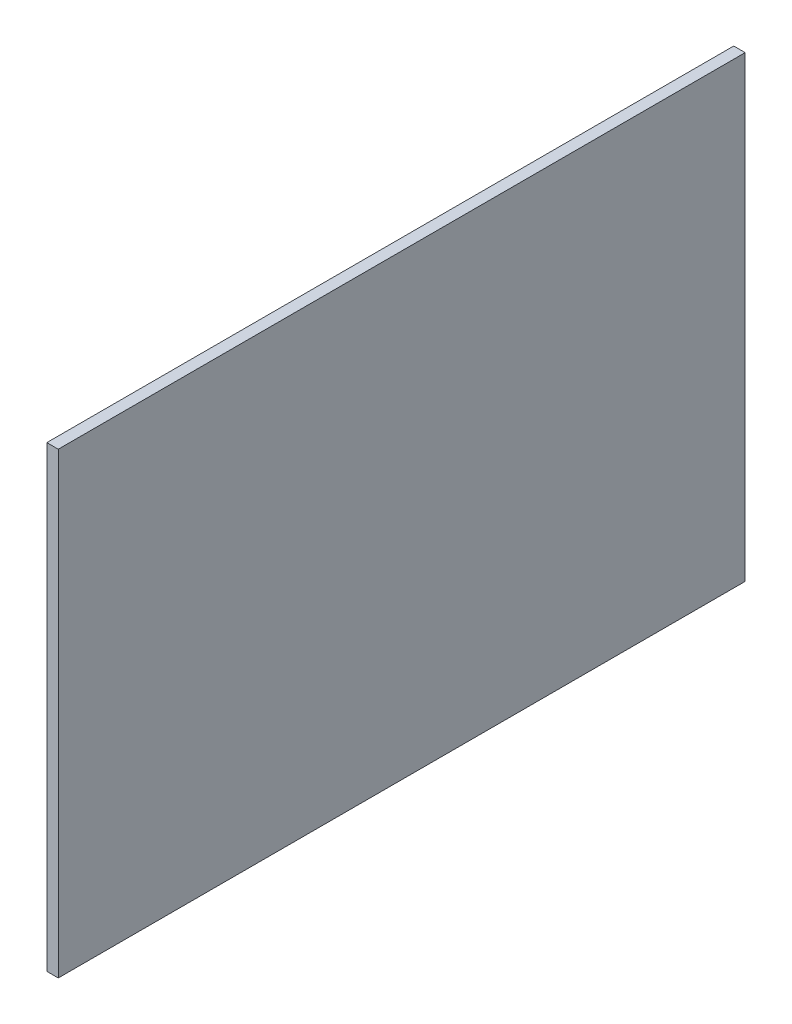
ISO-10303-21;
HEADER;
FILE_DESCRIPTION(('STEP AP214'),'2;1');
FILE_NAME('part.step','',(''),(''),'','','');
FILE_SCHEMA(('AUTOMOTIVE_DESIGN { 1 0 10303 214 1 1 1 1 }'));
ENDSEC;
DATA;
#1=APPLICATION_CONTEXT('core data for automotive mechanical design processes');
#2=APPLICATION_PROTOCOL_DEFINITION('international standard','automotive_design',2000,#1);
#3=PRODUCT_CONTEXT('',#1,'mechanical');
#4=PRODUCT('Part','Part','',(#3));
#5=PRODUCT_RELATED_PRODUCT_CATEGORY('part','',(#4));
#6=PRODUCT_DEFINITION_FORMATION('','',#4);
#7=PRODUCT_DEFINITION_CONTEXT('part definition',#1,'design');
#8=PRODUCT_DEFINITION('design','',#6,#7);
#9=PRODUCT_DEFINITION_SHAPE('','',#8);
#10=(LENGTH_UNIT() NAMED_UNIT(*) SI_UNIT(.MILLI.,.METRE.));
#11=(NAMED_UNIT(*) PLANE_ANGLE_UNIT() SI_UNIT($,.RADIAN.));
#12=(NAMED_UNIT(*) SI_UNIT($,.STERADIAN.) SOLID_ANGLE_UNIT());
#13=UNCERTAINTY_MEASURE_WITH_UNIT(LENGTH_MEASURE(1.E-05),#10,'distance_accuracy_value','');
#14=(GEOMETRIC_REPRESENTATION_CONTEXT(3) GLOBAL_UNCERTAINTY_ASSIGNED_CONTEXT((#13)) GLOBAL_UNIT_ASSIGNED_CONTEXT((#10,
#11,#12)) REPRESENTATION_CONTEXT('',''));
#15=CARTESIAN_POINT('',(0.,0.,0.));
#16=DIRECTION('',(0.,0.,1.));
#17=DIRECTION('',(1.,0.,0.));
#18=AXIS2_PLACEMENT_3D('',#15,#16,#17);
#19=CARTESIAN_POINT('',(0.,0.,0.));
#20=DIRECTION('',(1.,0.,0.));
#21=DIRECTION('',(0.,0.,-1.));
#22=AXIS2_PLACEMENT_3D('',#19,#20,#21);
#23=PLANE('',#22);
#24=DIRECTION('',(0.,-1.,0.));
#25=VECTOR('',#24,1.);
#26=CARTESIAN_POINT('',(0.,-100.,150.));
#27=LINE('',#26,#25);
#28=CARTESIAN_POINT('',(0.,100.,150.));
#29=VERTEX_POINT('',#28);
#30=CARTESIAN_POINT('',(0.,-100.,150.));
#31=VERTEX_POINT('',#30);
#32=EDGE_CURVE('E142',#29,#31,#27,.T.);
#33=ORIENTED_EDGE('',*,*,#32,.F.);
#34=DIRECTION('',(0.,0.,1.));
#35=VECTOR('',#34,1.);
#36=CARTESIAN_POINT('',(0.,100.,-150.));
#37=LINE('',#36,#35);
#38=CARTESIAN_POINT('',(0.,100.,-150.));
#39=VERTEX_POINT('',#38);
#40=EDGE_CURVE('E155',#39,#29,#37,.T.);
#41=ORIENTED_EDGE('',*,*,#40,.F.);
#42=DIRECTION('',(0.,1.,0.));
#43=VECTOR('',#42,1.);
#44=CARTESIAN_POINT('',(0.,-100.,-150.));
#45=LINE('',#44,#43);
#46=CARTESIAN_POINT('',(0.,-100.,-150.));
#47=VERTEX_POINT('',#46);
#48=EDGE_CURVE('E163',#47,#39,#45,.T.);
#49=ORIENTED_EDGE('',*,*,#48,.F.);
#50=DIRECTION('',(0.,0.,-1.));
#51=VECTOR('',#50,1.);
#52=CARTESIAN_POINT('',(0.,-100.,-150.));
#53=LINE('',#52,#51);
#54=EDGE_CURVE('E145',#31,#47,#53,.T.);
#55=ORIENTED_EDGE('',*,*,#54,.F.);
#56=EDGE_LOOP('',(#33,#41,#49,#55));
#57=FACE_BOUND('',#56,.T.);
#58=CARTESIAN_POINT('',(0.,85.,135.));
#59=DIRECTION('',(-1.,0.,0.));
#60=DIRECTION('',(0.,0.,-1.));
#61=AXIS2_PLACEMENT_3D('',#58,#59,#60);
#62=CIRCLE('',#61,10.);
#63=CARTESIAN_POINT('',(0.,84.9999999999999,145.));
#64=VERTEX_POINT('',#63);
#65=CARTESIAN_POINT('',(0.,95.,135.));
#66=VERTEX_POINT('',#65);
#67=EDGE_CURVE('E48',#64,#66,#62,.T.);
#68=ORIENTED_EDGE('',*,*,#67,.F.);
#69=DIRECTION('',(0.,1.,0.));
#70=VECTOR('',#69,1.);
#71=CARTESIAN_POINT('',(0.,-84.9999999999999,145.));
#72=LINE('',#71,#70);
#73=CARTESIAN_POINT('',(0.,-84.9999999999999,145.));
#74=VERTEX_POINT('',#73);
#75=EDGE_CURVE('E52',#74,#64,#72,.T.);
#76=ORIENTED_EDGE('',*,*,#75,.F.);
#77=CARTESIAN_POINT('',(0.,-85.,135.));
#78=DIRECTION('',(-1.,0.,0.));
#79=DIRECTION('',(0.,0.,-1.));
#80=AXIS2_PLACEMENT_3D('',#77,#78,#79);
#81=CIRCLE('',#80,10.);
#82=CARTESIAN_POINT('',(0.,-95.,135.));
#83=VERTEX_POINT('',#82);
#84=EDGE_CURVE('E325',#83,#74,#81,.T.);
#85=ORIENTED_EDGE('',*,*,#84,.F.);
#86=DIRECTION('',(0.,0.,1.));
#87=VECTOR('',#86,1.);
#88=CARTESIAN_POINT('',(0.,-95.,-135.));
#89=LINE('',#88,#87);
#90=CARTESIAN_POINT('',(0.,-95.,-135.));
#91=VERTEX_POINT('',#90);
#92=EDGE_CURVE('E359',#91,#83,#89,.T.);
#93=ORIENTED_EDGE('',*,*,#92,.F.);
#94=CARTESIAN_POINT('',(0.,-85.,-135.));
#95=DIRECTION('',(-1.,0.,0.));
#96=DIRECTION('',(0.,0.,1.));
#97=AXIS2_PLACEMENT_3D('',#94,#95,#96);
#98=CIRCLE('',#97,10.);
#99=CARTESIAN_POINT('',(0.,-84.9999999999999,-145.));
#100=VERTEX_POINT('',#99);
#101=EDGE_CURVE('E352',#100,#91,#98,.T.);
#102=ORIENTED_EDGE('',*,*,#101,.F.);
#103=DIRECTION('',(0.,-1.,0.));
#104=VECTOR('',#103,1.);
#105=CARTESIAN_POINT('',(0.,84.9999999999999,-145.));
#106=LINE('',#105,#104);
#107=CARTESIAN_POINT('',(0.,84.9999999999999,-145.));
#108=VERTEX_POINT('',#107);
#109=EDGE_CURVE('E346',#108,#100,#106,.T.);
#110=ORIENTED_EDGE('',*,*,#109,.F.);
#111=CARTESIAN_POINT('',(0.,85.,-135.));
#112=DIRECTION('',(-1.,0.,0.));
#113=DIRECTION('',(0.,0.,-1.));
#114=AXIS2_PLACEMENT_3D('',#111,#112,#113);
#115=CIRCLE('',#114,10.);
#116=CARTESIAN_POINT('',(0.,95.,-135.));
#117=VERTEX_POINT('',#116);
#118=EDGE_CURVE('E349',#117,#108,#115,.T.);
#119=ORIENTED_EDGE('',*,*,#118,.F.);
#120=DIRECTION('',(0.,0.,-1.));
#121=VECTOR('',#120,1.);
#122=CARTESIAN_POINT('',(0.,95.,135.));
#123=LINE('',#122,#121);
#124=EDGE_CURVE('E350',#66,#117,#123,.T.);
#125=ORIENTED_EDGE('',*,*,#124,.F.);
#126=EDGE_LOOP('',(#68,#76,#85,#93,#102,#110,#119,#125));
#127=FACE_BOUND('',#126,.T.);
#128=ADVANCED_FACE('F33',(#57,#127),#23,.F.);
#129=CARTESIAN_POINT('',(5.,-100.,150.));
#130=DIRECTION('',(0.,0.,-1.));
#131=DIRECTION('',(-1.,0.,0.));
#132=AXIS2_PLACEMENT_3D('',#129,#130,#131);
#133=PLANE('',#132);
#134=ORIENTED_EDGE('',*,*,#32,.T.);
#135=DIRECTION('',(-1.,0.,0.));
#136=VECTOR('',#135,1.);
#137=CARTESIAN_POINT('',(5.,-100.,150.));
#138=LINE('',#137,#136);
#139=CARTESIAN_POINT('',(5.,-100.,150.));
#140=VERTEX_POINT('',#139);
#141=EDGE_CURVE('E11',#140,#31,#138,.T.);
#142=ORIENTED_EDGE('',*,*,#141,.F.);
#143=DIRECTION('',(0.,-1.,0.));
#144=VECTOR('',#143,1.);
#145=CARTESIAN_POINT('',(5.,-100.,150.));
#146=LINE('',#145,#144);
#147=CARTESIAN_POINT('',(5.,100.,150.));
#148=VERTEX_POINT('',#147);
#149=EDGE_CURVE('E151',#148,#140,#146,.T.);
#150=ORIENTED_EDGE('',*,*,#149,.F.);
#151=DIRECTION('',(-1.,0.,0.));
#152=VECTOR('',#151,1.);
#153=CARTESIAN_POINT('',(5.,100.,150.));
#154=LINE('',#153,#152);
#155=EDGE_CURVE('E160',#148,#29,#154,.T.);
#156=ORIENTED_EDGE('',*,*,#155,.T.);
#157=EDGE_LOOP('',(#134,#142,#150,#156));
#158=FACE_BOUND('',#157,.T.);
#159=ADVANCED_FACE('F35',(#158),#133,.F.);
#160=CARTESIAN_POINT('',(5.,-100.,-150.));
#161=DIRECTION('',(0.,1.,0.));
#162=DIRECTION('',(0.,0.,1.));
#163=AXIS2_PLACEMENT_3D('',#160,#161,#162);
#164=PLANE('',#163);
#165=ORIENTED_EDGE('',*,*,#54,.T.);
#166=DIRECTION('',(-1.,0.,0.));
#167=VECTOR('',#166,1.);
#168=CARTESIAN_POINT('',(5.,-100.,-150.));
#169=LINE('',#168,#167);
#170=CARTESIAN_POINT('',(5.,-100.,-150.));
#171=VERTEX_POINT('',#170);
#172=EDGE_CURVE('E41',#171,#47,#169,.T.);
#173=ORIENTED_EDGE('',*,*,#172,.F.);
#174=DIRECTION('',(0.,0.,-1.));
#175=VECTOR('',#174,1.);
#176=CARTESIAN_POINT('',(5.,-100.,-150.));
#177=LINE('',#176,#175);
#178=EDGE_CURVE('E154',#140,#171,#177,.T.);
#179=ORIENTED_EDGE('',*,*,#178,.F.);
#180=ORIENTED_EDGE('',*,*,#141,.T.);
#181=EDGE_LOOP('',(#165,#173,#179,#180));
#182=FACE_BOUND('',#181,.T.);
#183=ADVANCED_FACE('F190',(#182),#164,.F.);
#184=CARTESIAN_POINT('',(5.,-100.,-150.));
#185=DIRECTION('',(0.,0.,1.));
#186=DIRECTION('',(1.,0.,0.));
#187=AXIS2_PLACEMENT_3D('',#184,#185,#186);
#188=PLANE('',#187);
#189=ORIENTED_EDGE('',*,*,#48,.T.);
#190=DIRECTION('',(-1.,0.,0.));
#191=VECTOR('',#190,1.);
#192=CARTESIAN_POINT('',(5.,100.,-150.));
#193=LINE('',#192,#191);
#194=CARTESIAN_POINT('',(5.,100.,-150.));
#195=VERTEX_POINT('',#194);
#196=EDGE_CURVE('E168',#195,#39,#193,.T.);
#197=ORIENTED_EDGE('',*,*,#196,.F.);
#198=DIRECTION('',(0.,1.,0.));
#199=VECTOR('',#198,1.);
#200=CARTESIAN_POINT('',(5.,-100.,-150.));
#201=LINE('',#200,#199);
#202=EDGE_CURVE('E157',#171,#195,#201,.T.);
#203=ORIENTED_EDGE('',*,*,#202,.F.);
#204=ORIENTED_EDGE('',*,*,#172,.T.);
#205=EDGE_LOOP('',(#189,#197,#203,#204));
#206=FACE_BOUND('',#205,.T.);
#207=ADVANCED_FACE('F175',(#206),#188,.F.);
#208=CARTESIAN_POINT('',(5.,100.,-150.));
#209=DIRECTION('',(0.,-1.,0.));
#210=DIRECTION('',(0.,0.,-1.));
#211=AXIS2_PLACEMENT_3D('',#208,#209,#210);
#212=PLANE('',#211);
#213=ORIENTED_EDGE('',*,*,#40,.T.);
#214=ORIENTED_EDGE('',*,*,#155,.F.);
#215=DIRECTION('',(0.,0.,1.));
#216=VECTOR('',#215,1.);
#217=CARTESIAN_POINT('',(5.,100.,-150.));
#218=LINE('',#217,#216);
#219=EDGE_CURVE('E159',#195,#148,#218,.T.);
#220=ORIENTED_EDGE('',*,*,#219,.F.);
#221=ORIENTED_EDGE('',*,*,#196,.T.);
#222=EDGE_LOOP('',(#213,#214,#220,#221));
#223=FACE_BOUND('',#222,.T.);
#224=ADVANCED_FACE('F183',(#223),#212,.F.);
#225=CARTESIAN_POINT('',(5.,0.,0.));
#226=DIRECTION('',(1.,0.,0.));
#227=DIRECTION('',(0.,0.,-1.));
#228=AXIS2_PLACEMENT_3D('',#225,#226,#227);
#229=PLANE('',#228);
#230=ORIENTED_EDGE('',*,*,#149,.T.);
#231=ORIENTED_EDGE('',*,*,#178,.T.);
#232=ORIENTED_EDGE('',*,*,#202,.T.);
#233=ORIENTED_EDGE('',*,*,#219,.T.);
#234=EDGE_LOOP('',(#230,#231,#232,#233));
#235=FACE_BOUND('',#234,.T.);
#236=ADVANCED_FACE('F189',(#235),#229,.T.);
#237=CARTESIAN_POINT('',(-5.,85.,135.));
#238=DIRECTION('',(1.,0.,0.));
#239=DIRECTION('',(0.,0.,-1.));
#240=AXIS2_PLACEMENT_3D('',#237,#238,#239);
#241=CYLINDRICAL_SURFACE('',#240,10.);
#242=ORIENTED_EDGE('',*,*,#67,.T.);
#243=DIRECTION('',(1.,0.,0.));
#244=VECTOR('',#243,1.);
#245=CARTESIAN_POINT('',(-5.,95.,135.));
#246=LINE('',#245,#244);
#247=CARTESIAN_POINT('',(-5.,95.,135.));
#248=VERTEX_POINT('',#247);
#249=EDGE_CURVE('E125',#248,#66,#246,.T.);
#250=ORIENTED_EDGE('',*,*,#249,.F.);
#251=CARTESIAN_POINT('',(-5.,85.,135.));
#252=DIRECTION('',(-1.,0.,0.));
#253=DIRECTION('',(0.,0.,-1.));
#254=AXIS2_PLACEMENT_3D('',#251,#252,#253);
#255=CIRCLE('',#254,10.);
#256=CARTESIAN_POINT('',(-5.,84.9999999999999,145.));
#257=VERTEX_POINT('',#256);
#258=EDGE_CURVE('E131',#257,#248,#255,.T.);
#259=ORIENTED_EDGE('',*,*,#258,.F.);
#260=DIRECTION('',(1.,0.,0.));
#261=VECTOR('',#260,1.);
#262=CARTESIAN_POINT('',(-5.,84.9999999999999,145.));
#263=LINE('',#262,#261);
#264=EDGE_CURVE('E322',#257,#64,#263,.T.);
#265=ORIENTED_EDGE('',*,*,#264,.T.);
#266=EDGE_LOOP('',(#242,#250,#259,#265));
#267=FACE_BOUND('',#266,.T.);
#268=ADVANCED_FACE('F141',(#267),#241,.T.);
#269=CARTESIAN_POINT('',(-5.,95.,135.));
#270=DIRECTION('',(0.,-1.,0.));
#271=DIRECTION('',(0.,0.,-1.));
#272=AXIS2_PLACEMENT_3D('',#269,#270,#271);
#273=PLANE('',#272);
#274=ORIENTED_EDGE('',*,*,#124,.T.);
#275=DIRECTION('',(1.,0.,0.));
#276=VECTOR('',#275,1.);
#277=CARTESIAN_POINT('',(-5.,95.,-135.));
#278=LINE('',#277,#276);
#279=CARTESIAN_POINT('',(-5.,95.,-135.));
#280=VERTEX_POINT('',#279);
#281=EDGE_CURVE('E127',#280,#117,#278,.T.);
#282=ORIENTED_EDGE('',*,*,#281,.F.);
#283=DIRECTION('',(0.,0.,-1.));
#284=VECTOR('',#283,1.);
#285=CARTESIAN_POINT('',(-5.,95.,135.));
#286=LINE('',#285,#284);
#287=EDGE_CURVE('E120',#248,#280,#286,.T.);
#288=ORIENTED_EDGE('',*,*,#287,.F.);
#289=ORIENTED_EDGE('',*,*,#249,.T.);
#290=EDGE_LOOP('',(#274,#282,#288,#289));
#291=FACE_BOUND('',#290,.T.);
#292=ADVANCED_FACE('F123',(#291),#273,.F.);
#293=CARTESIAN_POINT('',(-5.,85.,-135.));
#294=DIRECTION('',(1.,0.,0.));
#295=DIRECTION('',(0.,0.,-1.));
#296=AXIS2_PLACEMENT_3D('',#293,#294,#295);
#297=CYLINDRICAL_SURFACE('',#296,10.);
#298=ORIENTED_EDGE('',*,*,#118,.T.);
#299=DIRECTION('',(1.,0.,0.));
#300=VECTOR('',#299,1.);
#301=CARTESIAN_POINT('',(-5.,84.9999999999999,-145.));
#302=LINE('',#301,#300);
#303=CARTESIAN_POINT('',(-5.,84.9999999999999,-145.));
#304=VERTEX_POINT('',#303);
#305=EDGE_CURVE('E147',#304,#108,#302,.T.);
#306=ORIENTED_EDGE('',*,*,#305,.F.);
#307=CARTESIAN_POINT('',(-5.,85.,-135.));
#308=DIRECTION('',(-1.,0.,0.));
#309=DIRECTION('',(0.,0.,-1.));
#310=AXIS2_PLACEMENT_3D('',#307,#308,#309);
#311=CIRCLE('',#310,10.);
#312=EDGE_CURVE('E130',#280,#304,#311,.T.);
#313=ORIENTED_EDGE('',*,*,#312,.F.);
#314=ORIENTED_EDGE('',*,*,#281,.T.);
#315=EDGE_LOOP('',(#298,#306,#313,#314));
#316=FACE_BOUND('',#315,.T.);
#317=ADVANCED_FACE('F214',(#316),#297,.T.);
#318=CARTESIAN_POINT('',(-5.,84.9999999999999,-145.));
#319=DIRECTION('',(0.,0.,1.));
#320=DIRECTION('',(1.,0.,0.));
#321=AXIS2_PLACEMENT_3D('',#318,#319,#320);
#322=PLANE('',#321);
#323=ORIENTED_EDGE('',*,*,#109,.T.);
#324=DIRECTION('',(1.,0.,0.));
#325=VECTOR('',#324,1.);
#326=CARTESIAN_POINT('',(-5.,-84.9999999999999,-145.));
#327=LINE('',#326,#325);
#328=CARTESIAN_POINT('',(-5.,-84.9999999999999,-145.));
#329=VERTEX_POINT('',#328);
#330=EDGE_CURVE('E339',#329,#100,#327,.T.);
#331=ORIENTED_EDGE('',*,*,#330,.F.);
#332=DIRECTION('',(0.,-1.,0.));
#333=VECTOR('',#332,1.);
#334=CARTESIAN_POINT('',(-5.,84.9999999999999,-145.));
#335=LINE('',#334,#333);
#336=EDGE_CURVE('E347',#304,#329,#335,.T.);
#337=ORIENTED_EDGE('',*,*,#336,.F.);
#338=ORIENTED_EDGE('',*,*,#305,.T.);
#339=EDGE_LOOP('',(#323,#331,#337,#338));
#340=FACE_BOUND('',#339,.T.);
#341=ADVANCED_FACE('F219',(#340),#322,.F.);
#342=CARTESIAN_POINT('',(-5.,-85.,-135.));
#343=DIRECTION('',(1.,0.,0.));
#344=DIRECTION('',(0.,0.,-1.));
#345=AXIS2_PLACEMENT_3D('',#342,#343,#344);
#346=CYLINDRICAL_SURFACE('',#345,10.);
#347=ORIENTED_EDGE('',*,*,#101,.T.);
#348=DIRECTION('',(1.,0.,0.));
#349=VECTOR('',#348,1.);
#350=CARTESIAN_POINT('',(-5.,-95.,-135.));
#351=LINE('',#350,#349);
#352=CARTESIAN_POINT('',(-5.,-95.,-135.));
#353=VERTEX_POINT('',#352);
#354=EDGE_CURVE('E336',#353,#91,#351,.T.);
#355=ORIENTED_EDGE('',*,*,#354,.F.);
#356=CARTESIAN_POINT('',(-5.,-85.,-135.));
#357=DIRECTION('',(-1.,0.,0.));
#358=DIRECTION('',(0.,0.,1.));
#359=AXIS2_PLACEMENT_3D('',#356,#357,#358);
#360=CIRCLE('',#359,10.);
#361=EDGE_CURVE('E367',#329,#353,#360,.T.);
#362=ORIENTED_EDGE('',*,*,#361,.F.);
#363=ORIENTED_EDGE('',*,*,#330,.T.);
#364=EDGE_LOOP('',(#347,#355,#362,#363));
#365=FACE_BOUND('',#364,.T.);
#366=ADVANCED_FACE('F223',(#365),#346,.T.);
#367=CARTESIAN_POINT('',(-5.,-95.,-135.));
#368=DIRECTION('',(0.,1.,0.));
#369=DIRECTION('',(0.,0.,1.));
#370=AXIS2_PLACEMENT_3D('',#367,#368,#369);
#371=PLANE('',#370);
#372=ORIENTED_EDGE('',*,*,#92,.T.);
#373=DIRECTION('',(1.,0.,0.));
#374=VECTOR('',#373,1.);
#375=CARTESIAN_POINT('',(-5.,-95.,135.));
#376=LINE('',#375,#374);
#377=CARTESIAN_POINT('',(-5.,-95.,135.));
#378=VERTEX_POINT('',#377);
#379=EDGE_CURVE('E328',#378,#83,#376,.T.);
#380=ORIENTED_EDGE('',*,*,#379,.F.);
#381=DIRECTION('',(0.,0.,1.));
#382=VECTOR('',#381,1.);
#383=CARTESIAN_POINT('',(-5.,-95.,-135.));
#384=LINE('',#383,#382);
#385=EDGE_CURVE('E365',#353,#378,#384,.T.);
#386=ORIENTED_EDGE('',*,*,#385,.F.);
#387=ORIENTED_EDGE('',*,*,#354,.T.);
#388=EDGE_LOOP('',(#372,#380,#386,#387));
#389=FACE_BOUND('',#388,.T.);
#390=ADVANCED_FACE('F227',(#389),#371,.F.);
#391=CARTESIAN_POINT('',(-5.,-85.,135.));
#392=DIRECTION('',(1.,0.,0.));
#393=DIRECTION('',(0.,0.,-1.));
#394=AXIS2_PLACEMENT_3D('',#391,#392,#393);
#395=CYLINDRICAL_SURFACE('',#394,10.);
#396=ORIENTED_EDGE('',*,*,#84,.T.);
#397=DIRECTION('',(1.,0.,0.));
#398=VECTOR('',#397,1.);
#399=CARTESIAN_POINT('',(-5.,-84.9999999999999,145.));
#400=LINE('',#399,#398);
#401=CARTESIAN_POINT('',(-5.,-84.9999999999999,145.));
#402=VERTEX_POINT('',#401);
#403=EDGE_CURVE('E324',#402,#74,#400,.T.);
#404=ORIENTED_EDGE('',*,*,#403,.F.);
#405=CARTESIAN_POINT('',(-5.,-85.,135.));
#406=DIRECTION('',(-1.,0.,0.));
#407=DIRECTION('',(0.,0.,-1.));
#408=AXIS2_PLACEMENT_3D('',#405,#406,#407);
#409=CIRCLE('',#408,10.);
#410=EDGE_CURVE('E330',#378,#402,#409,.T.);
#411=ORIENTED_EDGE('',*,*,#410,.F.);
#412=ORIENTED_EDGE('',*,*,#379,.T.);
#413=EDGE_LOOP('',(#396,#404,#411,#412));
#414=FACE_BOUND('',#413,.T.);
#415=ADVANCED_FACE('F231',(#414),#395,.T.);
#416=CARTESIAN_POINT('',(-5.,-84.9999999999999,145.));
#417=DIRECTION('',(0.,0.,-1.));
#418=DIRECTION('',(-1.,0.,0.));
#419=AXIS2_PLACEMENT_3D('',#416,#417,#418);
#420=PLANE('',#419);
#421=ORIENTED_EDGE('',*,*,#75,.T.);
#422=ORIENTED_EDGE('',*,*,#264,.F.);
#423=DIRECTION('',(0.,1.,0.));
#424=VECTOR('',#423,1.);
#425=CARTESIAN_POINT('',(-5.,-84.9999999999999,145.));
#426=LINE('',#425,#424);
#427=EDGE_CURVE('E136',#402,#257,#426,.T.);
#428=ORIENTED_EDGE('',*,*,#427,.F.);
#429=ORIENTED_EDGE('',*,*,#403,.T.);
#430=EDGE_LOOP('',(#421,#422,#428,#429));
#431=FACE_BOUND('',#430,.T.);
#432=ADVANCED_FACE('F235',(#431),#420,.F.);
#433=CARTESIAN_POINT('',(-5.,85.,135.));
#434=DIRECTION('',(1.,0.,0.));
#435=DIRECTION('',(0.,0.,-1.));
#436=AXIS2_PLACEMENT_3D('',#433,#434,#435);
#437=PLANE('',#436);
#438=ORIENTED_EDGE('',*,*,#258,.T.);
#439=ORIENTED_EDGE('',*,*,#287,.T.);
#440=ORIENTED_EDGE('',*,*,#312,.T.);
#441=ORIENTED_EDGE('',*,*,#336,.T.);
#442=ORIENTED_EDGE('',*,*,#361,.T.);
#443=ORIENTED_EDGE('',*,*,#385,.T.);
#444=ORIENTED_EDGE('',*,*,#410,.T.);
#445=ORIENTED_EDGE('',*,*,#427,.T.);
#446=EDGE_LOOP('',(#438,#439,#440,#441,#442,#443,#444,#445));
#447=FACE_BOUND('',#446,.T.);
#448=ADVANCED_FACE('F134',(#447),#437,.F.);
#449=CLOSED_SHELL('',(#128,#159,#183,#207,#224,#236,#268,#292,#317,#341,#366,#390,#415,#432,#448));
#450=MANIFOLD_SOLID_BREP('B2',#449);
#451=ADVANCED_BREP_SHAPE_REPRESENTATION('',(#18,#450),#14);
#452=SHAPE_DEFINITION_REPRESENTATION(#9,#451);
ENDSEC;
END-ISO-10303-21;
